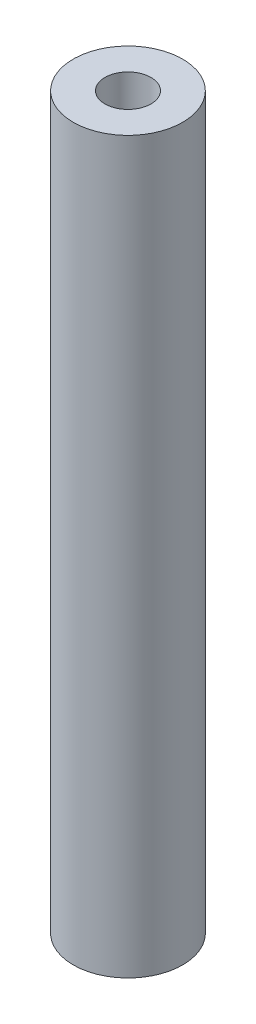
ISO-10303-21;
HEADER;
FILE_DESCRIPTION(('STEP AP214'),'2;1');
FILE_NAME('part.step','',(''),(''),'','','');
FILE_SCHEMA(('AUTOMOTIVE_DESIGN { 1 0 10303 214 1 1 1 1 }'));
ENDSEC;
DATA;
#1=APPLICATION_CONTEXT('core data for automotive mechanical design processes');
#2=APPLICATION_PROTOCOL_DEFINITION('international standard','automotive_design',2000,#1);
#3=PRODUCT_CONTEXT('',#1,'mechanical');
#4=PRODUCT('Part','Part','',(#3));
#5=PRODUCT_RELATED_PRODUCT_CATEGORY('part','',(#4));
#6=PRODUCT_DEFINITION_FORMATION('','',#4);
#7=PRODUCT_DEFINITION_CONTEXT('part definition',#1,'design');
#8=PRODUCT_DEFINITION('design','',#6,#7);
#9=PRODUCT_DEFINITION_SHAPE('','',#8);
#10=(LENGTH_UNIT() NAMED_UNIT(*) SI_UNIT(.MILLI.,.METRE.));
#11=(NAMED_UNIT(*) PLANE_ANGLE_UNIT() SI_UNIT($,.RADIAN.));
#12=(NAMED_UNIT(*) SI_UNIT($,.STERADIAN.) SOLID_ANGLE_UNIT());
#13=UNCERTAINTY_MEASURE_WITH_UNIT(LENGTH_MEASURE(1.E-05),#10,'distance_accuracy_value','');
#14=(GEOMETRIC_REPRESENTATION_CONTEXT(3) GLOBAL_UNCERTAINTY_ASSIGNED_CONTEXT((#13)) GLOBAL_UNIT_ASSIGNED_CONTEXT((#10,
#11,#12)) REPRESENTATION_CONTEXT('',''));
#15=CARTESIAN_POINT('',(0.,0.,0.));
#16=DIRECTION('',(0.,0.,1.));
#17=DIRECTION('',(1.,0.,0.));
#18=AXIS2_PLACEMENT_3D('',#15,#16,#17);
#19=CARTESIAN_POINT('',(0.,46.,0.));
#20=DIRECTION('',(0.,1.,0.));
#21=DIRECTION('',(0.,0.,1.));
#22=AXIS2_PLACEMENT_3D('',#19,#20,#21);
#23=PLANE('',#22);
#24=CARTESIAN_POINT('',(0.,46.,0.));
#25=DIRECTION('',(0.,1.,0.));
#26=DIRECTION('',(0.,0.,1.));
#27=AXIS2_PLACEMENT_3D('',#24,#25,#26);
#28=CIRCLE('',#27,3.45);
#29=CARTESIAN_POINT('',(0.,46.,3.45));
#30=VERTEX_POINT('',#29);
#31=EDGE_CURVE('E10',#30,#30,#28,.T.);
#32=ORIENTED_EDGE('',*,*,#31,.T.);
#33=EDGE_LOOP('',(#32));
#34=FACE_BOUND('',#33,.T.);
#35=CARTESIAN_POINT('',(0.,46.,0.));
#36=DIRECTION('',(0.,1.,0.));
#37=DIRECTION('',(0.,0.,1.));
#38=AXIS2_PLACEMENT_3D('',#35,#36,#37);
#39=CIRCLE('',#38,1.45);
#40=CARTESIAN_POINT('',(0.,46.,1.45));
#41=VERTEX_POINT('',#40);
#42=EDGE_CURVE('E42',#41,#41,#39,.T.);
#43=ORIENTED_EDGE('',*,*,#42,.F.);
#44=EDGE_LOOP('',(#43));
#45=FACE_BOUND('',#44,.T.);
#46=ADVANCED_FACE('F31',(#34,#45),#23,.T.);
#47=CARTESIAN_POINT('',(0.,0.,0.));
#48=DIRECTION('',(0.,1.,0.));
#49=DIRECTION('',(0.,0.,1.));
#50=AXIS2_PLACEMENT_3D('',#47,#48,#49);
#51=PLANE('',#50);
#52=CARTESIAN_POINT('',(0.,0.,0.));
#53=DIRECTION('',(0.,1.,0.));
#54=DIRECTION('',(0.,0.,1.));
#55=AXIS2_PLACEMENT_3D('',#52,#53,#54);
#56=CIRCLE('',#55,3.45);
#57=CARTESIAN_POINT('',(0.,0.,3.45));
#58=VERTEX_POINT('',#57);
#59=EDGE_CURVE('E35',#58,#58,#56,.T.);
#60=ORIENTED_EDGE('',*,*,#59,.F.);
#61=EDGE_LOOP('',(#60));
#62=FACE_BOUND('',#61,.T.);
#63=CARTESIAN_POINT('',(0.,0.,0.));
#64=DIRECTION('',(0.,1.,0.));
#65=DIRECTION('',(0.,0.,1.));
#66=AXIS2_PLACEMENT_3D('',#63,#64,#65);
#67=CIRCLE('',#66,1.45);
#68=CARTESIAN_POINT('',(0.,0.,1.45));
#69=VERTEX_POINT('',#68);
#70=EDGE_CURVE('E44',#69,#69,#67,.T.);
#71=ORIENTED_EDGE('',*,*,#70,.T.);
#72=EDGE_LOOP('',(#71));
#73=FACE_BOUND('',#72,.T.);
#74=ADVANCED_FACE('F54',(#62,#73),#51,.F.);
#75=CARTESIAN_POINT('',(0.,46.,0.));
#76=DIRECTION('',(0.,-1.,0.));
#77=DIRECTION('',(0.,0.,-1.));
#78=AXIS2_PLACEMENT_3D('',#75,#76,#77);
#79=CYLINDRICAL_SURFACE('',#78,3.45);
#80=ORIENTED_EDGE('',*,*,#31,.F.);
#81=EDGE_LOOP('',(#80));
#82=FACE_BOUND('',#81,.T.);
#83=ORIENTED_EDGE('',*,*,#59,.T.);
#84=EDGE_LOOP('',(#83));
#85=FACE_BOUND('',#84,.T.);
#86=ADVANCED_FACE('F33',(#82,#85),#79,.T.);
#87=CARTESIAN_POINT('',(0.,46.,0.));
#88=DIRECTION('',(0.,-1.,0.));
#89=DIRECTION('',(0.,0.,-1.));
#90=AXIS2_PLACEMENT_3D('',#87,#88,#89);
#91=CYLINDRICAL_SURFACE('',#90,1.45);
#92=ORIENTED_EDGE('',*,*,#42,.T.);
#93=EDGE_LOOP('',(#92));
#94=FACE_BOUND('',#93,.T.);
#95=ORIENTED_EDGE('',*,*,#70,.F.);
#96=EDGE_LOOP('',(#95));
#97=FACE_BOUND('',#96,.T.);
#98=ADVANCED_FACE('F50',(#94,#97),#91,.F.);
#99=CLOSED_SHELL('',(#46,#74,#86,#98));
#100=MANIFOLD_SOLID_BREP('B2',#99);
#101=ADVANCED_BREP_SHAPE_REPRESENTATION('',(#18,#100),#14);
#102=SHAPE_DEFINITION_REPRESENTATION(#9,#101);
ENDSEC;
END-ISO-10303-21;
